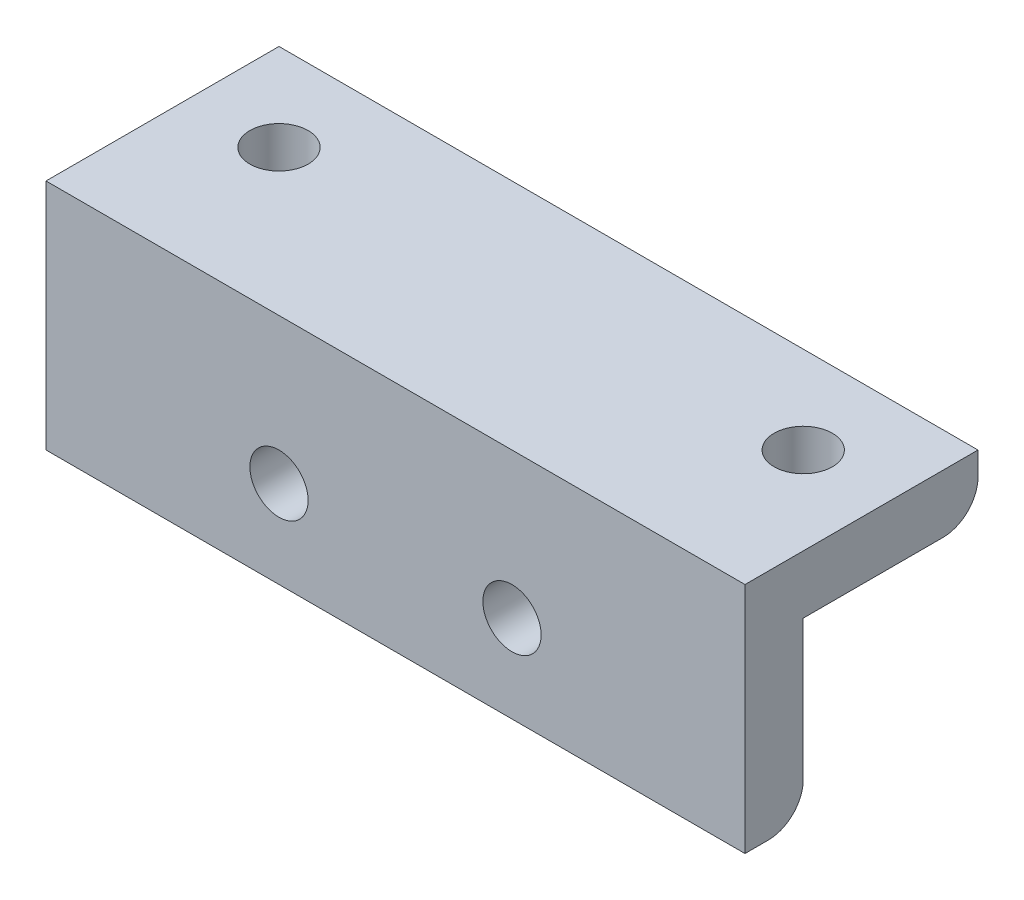
ISO-10303-21;
HEADER;
FILE_DESCRIPTION(('STEP AP214'),'2;1');
FILE_NAME('part.step','',(''),(''),'','','');
FILE_SCHEMA(('AUTOMOTIVE_DESIGN { 1 0 10303 214 1 1 1 1 }'));
ENDSEC;
DATA;
#1=APPLICATION_CONTEXT('core data for automotive mechanical design processes');
#2=APPLICATION_PROTOCOL_DEFINITION('international standard','automotive_design',2000,#1);
#3=PRODUCT_CONTEXT('',#1,'mechanical');
#4=PRODUCT('Part','Part','',(#3));
#5=PRODUCT_RELATED_PRODUCT_CATEGORY('part','',(#4));
#6=PRODUCT_DEFINITION_FORMATION('','',#4);
#7=PRODUCT_DEFINITION_CONTEXT('part definition',#1,'design');
#8=PRODUCT_DEFINITION('design','',#6,#7);
#9=PRODUCT_DEFINITION_SHAPE('','',#8);
#10=(LENGTH_UNIT() NAMED_UNIT(*) SI_UNIT(.MILLI.,.METRE.));
#11=(NAMED_UNIT(*) PLANE_ANGLE_UNIT() SI_UNIT($,.RADIAN.));
#12=(NAMED_UNIT(*) SI_UNIT($,.STERADIAN.) SOLID_ANGLE_UNIT());
#13=UNCERTAINTY_MEASURE_WITH_UNIT(LENGTH_MEASURE(1.E-05),#10,'distance_accuracy_value','');
#14=(GEOMETRIC_REPRESENTATION_CONTEXT(3) GLOBAL_UNCERTAINTY_ASSIGNED_CONTEXT((#13)) GLOBAL_UNIT_ASSIGNED_CONTEXT((#10,
#11,#12)) REPRESENTATION_CONTEXT('',''));
#15=CARTESIAN_POINT('',(0.,0.,0.));
#16=DIRECTION('',(0.,0.,1.));
#17=DIRECTION('',(1.,0.,0.));
#18=AXIS2_PLACEMENT_3D('',#15,#16,#17);
#19=CARTESIAN_POINT('',(76.2,23.2979648890606,25.3731034063662));
#20=DIRECTION('',(0.,0.,-1.));
#21=DIRECTION('',(0.,1.,0.));
#22=AXIS2_PLACEMENT_3D('',#19,#20,#21);
#23=PLANE('',#22);
#24=CARTESIAN_POINT('',(50.8,7.42296488906055,25.3731034063662));
#25=DIRECTION('',(0.,0.,1.));
#26=DIRECTION('',(1.,0.,0.));
#27=AXIS2_PLACEMENT_3D('',#24,#25,#26);
#28=CIRCLE('',#27,3.175);
#29=CARTESIAN_POINT('',(53.975,7.42296488906055,25.3731034063662));
#30=VERTEX_POINT('',#29);
#31=EDGE_CURVE('E158',#30,#30,#28,.T.);
#32=ORIENTED_EDGE('',*,*,#31,.F.);
#33=EDGE_LOOP('',(#32));
#34=FACE_BOUND('',#33,.T.);
#35=CARTESIAN_POINT('',(25.4,7.42296488906055,25.3731034063662));
#36=DIRECTION('',(0.,0.,1.));
#37=DIRECTION('',(1.,0.,0.));
#38=AXIS2_PLACEMENT_3D('',#35,#36,#37);
#39=CIRCLE('',#38,3.175);
#40=CARTESIAN_POINT('',(28.575,7.42296488906055,25.3731034063662));
#41=VERTEX_POINT('',#40);
#42=EDGE_CURVE('E147',#41,#41,#39,.T.);
#43=ORIENTED_EDGE('',*,*,#42,.F.);
#44=EDGE_LOOP('',(#43));
#45=FACE_BOUND('',#44,.T.);
#46=DIRECTION('',(0.,-1.,0.));
#47=VECTOR('',#46,1.);
#48=CARTESIAN_POINT('',(0.,23.2979648890606,25.3731034063662));
#49=LINE('',#48,#47);
#50=CARTESIAN_POINT('',(0.,23.2979648890606,25.3731034063662));
#51=VERTEX_POINT('',#50);
#52=CARTESIAN_POINT('',(0.,-2.10203511093945,25.3731034063662));
#53=VERTEX_POINT('',#52);
#54=EDGE_CURVE('E124',#51,#53,#49,.T.);
#55=ORIENTED_EDGE('',*,*,#54,.T.);
#56=DIRECTION('',(-1.,0.,0.));
#57=VECTOR('',#56,1.);
#58=CARTESIAN_POINT('',(76.2,-2.10203511093945,25.3731034063662));
#59=LINE('',#58,#57);
#60=CARTESIAN_POINT('',(76.2,-2.10203511093945,25.3731034063662));
#61=VERTEX_POINT('',#60);
#62=EDGE_CURVE('E106',#61,#53,#59,.T.);
#63=ORIENTED_EDGE('',*,*,#62,.F.);
#64=DIRECTION('',(0.,-1.,0.));
#65=VECTOR('',#64,1.);
#66=CARTESIAN_POINT('',(76.2,23.2979648890606,25.3731034063662));
#67=LINE('',#66,#65);
#68=CARTESIAN_POINT('',(76.2,23.2979648890606,25.3731034063662));
#69=VERTEX_POINT('',#68);
#70=EDGE_CURVE('E112',#69,#61,#67,.T.);
#71=ORIENTED_EDGE('',*,*,#70,.F.);
#72=DIRECTION('',(-1.,0.,0.));
#73=VECTOR('',#72,1.);
#74=CARTESIAN_POINT('',(76.2,23.2979648890606,25.3731034063662));
#75=LINE('',#74,#73);
#76=EDGE_CURVE('E175',#69,#51,#75,.T.);
#77=ORIENTED_EDGE('',*,*,#76,.T.);
#78=EDGE_LOOP('',(#55,#63,#71,#77));
#79=FACE_BOUND('',#78,.T.);
#80=ADVANCED_FACE('F34',(#34,#45,#79),#23,.F.);
#81=CARTESIAN_POINT('',(76.2,-2.10203511093945,19.0231034063662));
#82=DIRECTION('',(0.,1.,0.));
#83=DIRECTION('',(0.,0.,1.));
#84=AXIS2_PLACEMENT_3D('',#81,#82,#83);
#85=PLANE('',#84);
#86=DIRECTION('',(0.,0.,-1.));
#87=VECTOR('',#86,1.);
#88=CARTESIAN_POINT('',(0.,-2.10203511093945,19.0231034063662));
#89=LINE('',#88,#87);
#90=CARTESIAN_POINT('',(0.,-2.10203511093945,22.8331034063662));
#91=VERTEX_POINT('',#90);
#92=EDGE_CURVE('E177',#53,#91,#89,.T.);
#93=ORIENTED_EDGE('',*,*,#92,.T.);
#94=DIRECTION('',(-1.,0.,0.));
#95=VECTOR('',#94,1.);
#96=CARTESIAN_POINT('',(76.2,-2.10203511093945,22.8331034063662));
#97=LINE('',#96,#95);
#98=CARTESIAN_POINT('',(76.2,-2.10203511093945,22.8331034063662));
#99=VERTEX_POINT('',#98);
#100=EDGE_CURVE('E109',#91,#99,#97,.F.);
#101=ORIENTED_EDGE('',*,*,#100,.T.);
#102=DIRECTION('',(0.,0.,-1.));
#103=VECTOR('',#102,1.);
#104=CARTESIAN_POINT('',(76.2,-2.10203511093945,19.0231034063662));
#105=LINE('',#104,#103);
#106=EDGE_CURVE('E101',#61,#99,#105,.T.);
#107=ORIENTED_EDGE('',*,*,#106,.F.);
#108=ORIENTED_EDGE('',*,*,#62,.T.);
#109=EDGE_LOOP('',(#93,#101,#107,#108));
#110=FACE_BOUND('',#109,.T.);
#111=ADVANCED_FACE('F104',(#110),#85,.F.);
#112=CARTESIAN_POINT('',(76.2,16.9479648890606,19.0231034063662));
#113=DIRECTION('',(0.,0.,1.));
#114=DIRECTION('',(0.,-1.,0.));
#115=AXIS2_PLACEMENT_3D('',#112,#113,#114);
#116=PLANE('',#115);
#117=CARTESIAN_POINT('',(50.8,7.42296488906055,19.0231034063662));
#118=DIRECTION('',(0.,0.,1.));
#119=DIRECTION('',(0.,-1.,0.));
#120=AXIS2_PLACEMENT_3D('',#117,#118,#119);
#121=CIRCLE('',#120,3.175);
#122=CARTESIAN_POINT('',(53.975,7.42296488906055,19.0231034063662));
#123=VERTEX_POINT('',#122);
#124=EDGE_CURVE('E38',#123,#123,#121,.T.);
#125=ORIENTED_EDGE('',*,*,#124,.T.);
#126=EDGE_LOOP('',(#125));
#127=FACE_BOUND('',#126,.T.);
#128=CARTESIAN_POINT('',(25.4,7.42296488906055,19.0231034063662));
#129=DIRECTION('',(0.,0.,1.));
#130=DIRECTION('',(0.,-1.,0.));
#131=AXIS2_PLACEMENT_3D('',#128,#129,#130);
#132=CIRCLE('',#131,3.175);
#133=CARTESIAN_POINT('',(28.575,7.42296488906055,19.0231034063662));
#134=VERTEX_POINT('',#133);
#135=EDGE_CURVE('E144',#134,#134,#132,.T.);
#136=ORIENTED_EDGE('',*,*,#135,.T.);
#137=EDGE_LOOP('',(#136));
#138=FACE_BOUND('',#137,.T.);
#139=DIRECTION('',(0.,1.,0.));
#140=VECTOR('',#139,1.);
#141=CARTESIAN_POINT('',(76.2,16.9479648890606,19.0231034063662));
#142=LINE('',#141,#140);
#143=CARTESIAN_POINT('',(76.2,1.70796488906055,19.0231034063662));
#144=VERTEX_POINT('',#143);
#145=CARTESIAN_POINT('',(76.2,16.9479648890606,19.0231034063662));
#146=VERTEX_POINT('',#145);
#147=EDGE_CURVE('E111',#144,#146,#142,.T.);
#148=ORIENTED_EDGE('',*,*,#147,.F.);
#149=DIRECTION('',(-1.,0.,0.));
#150=VECTOR('',#149,1.);
#151=CARTESIAN_POINT('',(76.2,1.70796488906055,19.0231034063662));
#152=LINE('',#151,#150);
#153=CARTESIAN_POINT('',(0.,1.70796488906055,19.0231034063662));
#154=VERTEX_POINT('',#153);
#155=EDGE_CURVE('E125',#144,#154,#152,.T.);
#156=ORIENTED_EDGE('',*,*,#155,.T.);
#157=DIRECTION('',(0.,1.,0.));
#158=VECTOR('',#157,1.);
#159=CARTESIAN_POINT('',(0.,16.9479648890606,19.0231034063662));
#160=LINE('',#159,#158);
#161=CARTESIAN_POINT('',(0.,16.9479648890606,19.0231034063662));
#162=VERTEX_POINT('',#161);
#163=EDGE_CURVE('E179',#154,#162,#160,.T.);
#164=ORIENTED_EDGE('',*,*,#163,.T.);
#165=DIRECTION('',(-1.,0.,0.));
#166=VECTOR('',#165,1.);
#167=CARTESIAN_POINT('',(76.2,16.9479648890606,19.0231034063662));
#168=LINE('',#167,#166);
#169=EDGE_CURVE('E126',#146,#162,#168,.T.);
#170=ORIENTED_EDGE('',*,*,#169,.F.);
#171=EDGE_LOOP('',(#148,#156,#164,#170));
#172=FACE_BOUND('',#171,.T.);
#173=ADVANCED_FACE('F202',(#127,#138,#172),#116,.F.);
#174=CARTESIAN_POINT('',(76.2,16.9479648890606,19.0231034063662));
#175=DIRECTION('',(0.,1.,0.));
#176=DIRECTION('',(0.,0.,1.));
#177=AXIS2_PLACEMENT_3D('',#174,#175,#176);
#178=PLANE('',#177);
#179=CARTESIAN_POINT('',(66.675,16.9479648890606,9.49810340636623));
#180=DIRECTION('',(0.,1.,0.));
#181=DIRECTION('',(0.,0.,1.));
#182=AXIS2_PLACEMENT_3D('',#179,#180,#181);
#183=CIRCLE('',#182,3.175);
#184=CARTESIAN_POINT('',(66.675,16.9479648890606,12.6731034063662));
#185=VERTEX_POINT('',#184);
#186=EDGE_CURVE('E151',#185,#185,#183,.T.);
#187=ORIENTED_EDGE('',*,*,#186,.T.);
#188=EDGE_LOOP('',(#187));
#189=FACE_BOUND('',#188,.T.);
#190=CARTESIAN_POINT('',(9.525,16.9479648890606,9.49810340636623));
#191=DIRECTION('',(0.,1.,0.));
#192=DIRECTION('',(0.,0.,1.));
#193=AXIS2_PLACEMENT_3D('',#190,#191,#192);
#194=CIRCLE('',#193,3.175);
#195=CARTESIAN_POINT('',(9.525,16.9479648890606,12.6731034063662));
#196=VERTEX_POINT('',#195);
#197=EDGE_CURVE('E166',#196,#196,#194,.T.);
#198=ORIENTED_EDGE('',*,*,#197,.T.);
#199=EDGE_LOOP('',(#198));
#200=FACE_BOUND('',#199,.T.);
#201=DIRECTION('',(0.,0.,-1.));
#202=VECTOR('',#201,1.);
#203=CARTESIAN_POINT('',(0.,16.9479648890606,19.0231034063662));
#204=LINE('',#203,#202);
#205=CARTESIAN_POINT('',(0.,16.9479648890606,3.78310340636623));
#206=VERTEX_POINT('',#205);
#207=EDGE_CURVE('E181',#162,#206,#204,.T.);
#208=ORIENTED_EDGE('',*,*,#207,.T.);
#209=DIRECTION('',(-1.,0.,0.));
#210=VECTOR('',#209,1.);
#211=CARTESIAN_POINT('',(76.2,16.9479648890606,3.78310340636623));
#212=LINE('',#211,#210);
#213=CARTESIAN_POINT('',(76.2,16.9479648890606,3.78310340636623));
#214=VERTEX_POINT('',#213);
#215=EDGE_CURVE('E11',#206,#214,#212,.F.);
#216=ORIENTED_EDGE('',*,*,#215,.T.);
#217=DIRECTION('',(0.,0.,-1.));
#218=VECTOR('',#217,1.);
#219=CARTESIAN_POINT('',(76.2,16.9479648890606,19.0231034063662));
#220=LINE('',#219,#218);
#221=EDGE_CURVE('E170',#146,#214,#220,.T.);
#222=ORIENTED_EDGE('',*,*,#221,.F.);
#223=ORIENTED_EDGE('',*,*,#169,.T.);
#224=EDGE_LOOP('',(#208,#216,#222,#223));
#225=FACE_BOUND('',#224,.T.);
#226=ADVANCED_FACE('F204',(#189,#200,#225),#178,.F.);
#227=CARTESIAN_POINT('',(76.2,23.2979648890606,-0.0268965936337726));
#228=DIRECTION('',(0.,0.,1.));
#229=DIRECTION('',(0.,-1.,0.));
#230=AXIS2_PLACEMENT_3D('',#227,#228,#229);
#231=PLANE('',#230);
#232=DIRECTION('',(0.,1.,0.));
#233=VECTOR('',#232,1.);
#234=CARTESIAN_POINT('',(76.2,23.2979648890606,-0.0268965936337726));
#235=LINE('',#234,#233);
#236=CARTESIAN_POINT('',(76.2,20.7579648890606,-0.0268965936337729));
#237=VERTEX_POINT('',#236);
#238=CARTESIAN_POINT('',(76.2,23.2979648890606,-0.0268965936337726));
#239=VERTEX_POINT('',#238);
#240=EDGE_CURVE('E172',#237,#239,#235,.T.);
#241=ORIENTED_EDGE('',*,*,#240,.F.);
#242=DIRECTION('',(-1.,0.,0.));
#243=VECTOR('',#242,1.);
#244=CARTESIAN_POINT('',(76.2,20.7579648890606,-0.0268965936337729));
#245=LINE('',#244,#243);
#246=CARTESIAN_POINT('',(0.,20.7579648890606,-0.0268965936337729));
#247=VERTEX_POINT('',#246);
#248=EDGE_CURVE('E43',#237,#247,#245,.T.);
#249=ORIENTED_EDGE('',*,*,#248,.T.);
#250=DIRECTION('',(0.,1.,0.));
#251=VECTOR('',#250,1.);
#252=CARTESIAN_POINT('',(0.,23.2979648890606,-0.0268965936337726));
#253=LINE('',#252,#251);
#254=CARTESIAN_POINT('',(0.,23.2979648890606,-0.0268965936337726));
#255=VERTEX_POINT('',#254);
#256=EDGE_CURVE('E183',#247,#255,#253,.T.);
#257=ORIENTED_EDGE('',*,*,#256,.T.);
#258=DIRECTION('',(-1.,0.,0.));
#259=VECTOR('',#258,1.);
#260=CARTESIAN_POINT('',(76.2,23.2979648890606,-0.0268965936337726));
#261=LINE('',#260,#259);
#262=EDGE_CURVE('E132',#239,#255,#261,.T.);
#263=ORIENTED_EDGE('',*,*,#262,.F.);
#264=EDGE_LOOP('',(#241,#249,#257,#263));
#265=FACE_BOUND('',#264,.T.);
#266=ADVANCED_FACE('F207',(#265),#231,.F.);
#267=CARTESIAN_POINT('',(76.2,23.2979648890606,-0.0268965936337726));
#268=DIRECTION('',(0.,-1.,0.));
#269=DIRECTION('',(0.,0.,-1.));
#270=AXIS2_PLACEMENT_3D('',#267,#268,#269);
#271=PLANE('',#270);
#272=CARTESIAN_POINT('',(66.675,23.2979648890606,9.49810340636623));
#273=DIRECTION('',(0.,1.,0.));
#274=DIRECTION('',(0.,0.,1.));
#275=AXIS2_PLACEMENT_3D('',#272,#273,#274);
#276=CIRCLE('',#275,3.175);
#277=CARTESIAN_POINT('',(66.675,23.2979648890606,12.6731034063662));
#278=VERTEX_POINT('',#277);
#279=EDGE_CURVE('E146',#278,#278,#276,.T.);
#280=ORIENTED_EDGE('',*,*,#279,.F.);
#281=EDGE_LOOP('',(#280));
#282=FACE_BOUND('',#281,.T.);
#283=CARTESIAN_POINT('',(9.525,23.2979648890606,9.49810340636623));
#284=DIRECTION('',(0.,1.,0.));
#285=DIRECTION('',(0.,0.,1.));
#286=AXIS2_PLACEMENT_3D('',#283,#284,#285);
#287=CIRCLE('',#286,3.175);
#288=CARTESIAN_POINT('',(9.525,23.2979648890606,12.6731034063662));
#289=VERTEX_POINT('',#288);
#290=EDGE_CURVE('E163',#289,#289,#287,.T.);
#291=ORIENTED_EDGE('',*,*,#290,.F.);
#292=EDGE_LOOP('',(#291));
#293=FACE_BOUND('',#292,.T.);
#294=DIRECTION('',(0.,0.,1.));
#295=VECTOR('',#294,1.);
#296=CARTESIAN_POINT('',(0.,23.2979648890606,-0.0268965936337726));
#297=LINE('',#296,#295);
#298=EDGE_CURVE('E121',#255,#51,#297,.T.);
#299=ORIENTED_EDGE('',*,*,#298,.T.);
#300=ORIENTED_EDGE('',*,*,#76,.F.);
#301=DIRECTION('',(0.,0.,1.));
#302=VECTOR('',#301,1.);
#303=CARTESIAN_POINT('',(76.2,23.2979648890606,-0.0268965936337726));
#304=LINE('',#303,#302);
#305=EDGE_CURVE('E117',#239,#69,#304,.T.);
#306=ORIENTED_EDGE('',*,*,#305,.F.);
#307=ORIENTED_EDGE('',*,*,#262,.T.);
#308=EDGE_LOOP('',(#299,#300,#306,#307));
#309=FACE_BOUND('',#308,.T.);
#310=ADVANCED_FACE('F190',(#282,#293,#309),#271,.F.);
#311=CARTESIAN_POINT('',(76.2,0.,0.));
#312=DIRECTION('',(-1.,0.,0.));
#313=DIRECTION('',(0.,0.,1.));
#314=AXIS2_PLACEMENT_3D('',#311,#312,#313);
#315=PLANE('',#314);
#316=ORIENTED_EDGE('',*,*,#106,.T.);
#317=CARTESIAN_POINT('',(76.2,1.70796488906055,22.8331034063662));
#318=DIRECTION('',(-1.,0.,0.));
#319=DIRECTION('',(0.,0.,1.));
#320=AXIS2_PLACEMENT_3D('',#317,#318,#319);
#321=CIRCLE('',#320,3.81);
#322=EDGE_CURVE('E141',#99,#144,#321,.F.);
#323=ORIENTED_EDGE('',*,*,#322,.T.);
#324=ORIENTED_EDGE('',*,*,#147,.T.);
#325=ORIENTED_EDGE('',*,*,#221,.T.);
#326=CARTESIAN_POINT('',(76.2,20.7579648890606,3.78310340636623));
#327=DIRECTION('',(-1.,0.,0.));
#328=DIRECTION('',(0.,0.,1.));
#329=AXIS2_PLACEMENT_3D('',#326,#327,#328);
#330=CIRCLE('',#329,3.81);
#331=EDGE_CURVE('E51',#214,#237,#330,.F.);
#332=ORIENTED_EDGE('',*,*,#331,.T.);
#333=ORIENTED_EDGE('',*,*,#240,.T.);
#334=ORIENTED_EDGE('',*,*,#305,.T.);
#335=ORIENTED_EDGE('',*,*,#70,.T.);
#336=EDGE_LOOP('',(#316,#323,#324,#325,#332,#333,#334,#335));
#337=FACE_BOUND('',#336,.T.);
#338=ADVANCED_FACE('F115',(#337),#315,.F.);
#339=CARTESIAN_POINT('',(0.,0.,0.));
#340=DIRECTION('',(-1.,0.,0.));
#341=DIRECTION('',(0.,0.,1.));
#342=AXIS2_PLACEMENT_3D('',#339,#340,#341);
#343=PLANE('',#342);
#344=ORIENTED_EDGE('',*,*,#163,.F.);
#345=CARTESIAN_POINT('',(0.,1.70796488906055,22.8331034063662));
#346=DIRECTION('',(-1.,0.,0.));
#347=DIRECTION('',(0.,0.,1.));
#348=AXIS2_PLACEMENT_3D('',#345,#346,#347);
#349=CIRCLE('',#348,3.81);
#350=EDGE_CURVE('E137',#154,#91,#349,.T.);
#351=ORIENTED_EDGE('',*,*,#350,.T.);
#352=ORIENTED_EDGE('',*,*,#92,.F.);
#353=ORIENTED_EDGE('',*,*,#54,.F.);
#354=ORIENTED_EDGE('',*,*,#298,.F.);
#355=ORIENTED_EDGE('',*,*,#256,.F.);
#356=CARTESIAN_POINT('',(0.,20.7579648890606,3.78310340636623));
#357=DIRECTION('',(-1.,0.,0.));
#358=DIRECTION('',(0.,0.,1.));
#359=AXIS2_PLACEMENT_3D('',#356,#357,#358);
#360=CIRCLE('',#359,3.81);
#361=EDGE_CURVE('E129',#247,#206,#360,.T.);
#362=ORIENTED_EDGE('',*,*,#361,.T.);
#363=ORIENTED_EDGE('',*,*,#207,.F.);
#364=EDGE_LOOP('',(#344,#351,#352,#353,#354,#355,#362,#363));
#365=FACE_BOUND('',#364,.T.);
#366=ADVANCED_FACE('F195',(#365),#343,.T.);
#367=CARTESIAN_POINT('',(76.2,1.70796488906055,22.8331034063662));
#368=DIRECTION('',(-1.,0.,0.));
#369=DIRECTION('',(0.,0.,1.));
#370=AXIS2_PLACEMENT_3D('',#367,#368,#369);
#371=CYLINDRICAL_SURFACE('',#370,3.81);
#372=ORIENTED_EDGE('',*,*,#322,.F.);
#373=ORIENTED_EDGE('',*,*,#100,.F.);
#374=ORIENTED_EDGE('',*,*,#350,.F.);
#375=ORIENTED_EDGE('',*,*,#155,.F.);
#376=EDGE_LOOP('',(#372,#373,#374,#375));
#377=FACE_BOUND('',#376,.T.);
#378=ADVANCED_FACE('F197',(#377),#371,.T.);
#379=CARTESIAN_POINT('',(76.2,20.7579648890606,3.78310340636623));
#380=DIRECTION('',(-1.,0.,0.));
#381=DIRECTION('',(0.,0.,1.));
#382=AXIS2_PLACEMENT_3D('',#379,#380,#381);
#383=CYLINDRICAL_SURFACE('',#382,3.81);
#384=ORIENTED_EDGE('',*,*,#331,.F.);
#385=ORIENTED_EDGE('',*,*,#215,.F.);
#386=ORIENTED_EDGE('',*,*,#361,.F.);
#387=ORIENTED_EDGE('',*,*,#248,.F.);
#388=EDGE_LOOP('',(#384,#385,#386,#387));
#389=FACE_BOUND('',#388,.T.);
#390=ADVANCED_FACE('F36',(#389),#383,.T.);
#391=CARTESIAN_POINT('',(9.525,-52.9020351109395,9.49810340636622));
#392=DIRECTION('',(0.,1.,0.));
#393=DIRECTION('',(0.,0.,1.));
#394=AXIS2_PLACEMENT_3D('',#391,#392,#393);
#395=CYLINDRICAL_SURFACE('',#394,3.175);
#396=CARTESIAN_POINT('',(9.525,23.2979648890606,12.6731034063662));
#397=CARTESIAN_POINT('',(9.525,23.2318190557272,12.6731034063662));
#398=CARTESIAN_POINT('',(9.525,23.1656732223939,12.6731034063662));
#399=CARTESIAN_POINT('',(9.525,23.0333815557272,12.6731034063662));
#400=CARTESIAN_POINT('',(9.525,22.9672357223939,12.6731034063662));
#401=CARTESIAN_POINT('',(9.525,22.8349440557272,12.6731034063662));
#402=CARTESIAN_POINT('',(9.525,22.7687982223939,12.6731034063662));
#403=CARTESIAN_POINT('',(9.525,22.6365065557272,12.6731034063662));
#404=CARTESIAN_POINT('',(9.525,22.5703607223939,12.6731034063662));
#405=CARTESIAN_POINT('',(9.525,22.4380690557272,12.6731034063662));
#406=CARTESIAN_POINT('',(9.525,22.3719232223939,12.6731034063662));
#407=CARTESIAN_POINT('',(9.525,22.2396315557272,12.6731034063662));
#408=CARTESIAN_POINT('',(9.525,22.1734857223939,12.6731034063662));
#409=CARTESIAN_POINT('',(9.525,22.0411940557272,12.6731034063662));
#410=CARTESIAN_POINT('',(9.525,21.9750482223939,12.6731034063662));
#411=CARTESIAN_POINT('',(9.525,21.8427565557272,12.6731034063662));
#412=CARTESIAN_POINT('',(9.525,21.7766107223939,12.6731034063662));
#413=CARTESIAN_POINT('',(9.525,21.6443190557272,12.6731034063662));
#414=CARTESIAN_POINT('',(9.525,21.5781732223939,12.6731034063662));
#415=CARTESIAN_POINT('',(9.525,21.4458815557272,12.6731034063662));
#416=CARTESIAN_POINT('',(9.525,21.3797357223939,12.6731034063662));
#417=CARTESIAN_POINT('',(9.525,21.2474440557272,12.6731034063662));
#418=CARTESIAN_POINT('',(9.525,21.1812982223939,12.6731034063662));
#419=CARTESIAN_POINT('',(9.525,21.0490065557272,12.6731034063662));
#420=CARTESIAN_POINT('',(9.525,20.9828607223939,12.6731034063662));
#421=CARTESIAN_POINT('',(9.525,20.8505690557272,12.6731034063662));
#422=CARTESIAN_POINT('',(9.525,20.7844232223939,12.6731034063662));
#423=CARTESIAN_POINT('',(9.525,20.6521315557272,12.6731034063662));
#424=CARTESIAN_POINT('',(9.525,20.5859857223939,12.6731034063662));
#425=CARTESIAN_POINT('',(9.525,20.4536940557272,12.6731034063662));
#426=CARTESIAN_POINT('',(9.525,20.3875482223939,12.6731034063662));
#427=CARTESIAN_POINT('',(9.525,20.2552565557272,12.6731034063662));
#428=CARTESIAN_POINT('',(9.525,20.1891107223939,12.6731034063662));
#429=CARTESIAN_POINT('',(9.525,20.0568190557272,12.6731034063662));
#430=CARTESIAN_POINT('',(9.525,19.9906732223939,12.6731034063662));
#431=CARTESIAN_POINT('',(9.525,19.8583815557272,12.6731034063662));
#432=CARTESIAN_POINT('',(9.525,19.7922357223939,12.6731034063662));
#433=CARTESIAN_POINT('',(9.525,19.6599440557272,12.6731034063662));
#434=CARTESIAN_POINT('',(9.525,19.5937982223939,12.6731034063662));
#435=CARTESIAN_POINT('',(9.525,19.4615065557272,12.6731034063662));
#436=CARTESIAN_POINT('',(9.525,19.3953607223939,12.6731034063662));
#437=CARTESIAN_POINT('',(9.525,19.2630690557272,12.6731034063662));
#438=CARTESIAN_POINT('',(9.525,19.1969232223939,12.6731034063662));
#439=CARTESIAN_POINT('',(9.525,19.0646315557272,12.6731034063662));
#440=CARTESIAN_POINT('',(9.525,18.9984857223939,12.6731034063662));
#441=CARTESIAN_POINT('',(9.525,18.8661940557272,12.6731034063662));
#442=CARTESIAN_POINT('',(9.525,18.8000482223939,12.6731034063662));
#443=CARTESIAN_POINT('',(9.525,18.6677565557272,12.6731034063662));
#444=CARTESIAN_POINT('',(9.525,18.6016107223939,12.6731034063662));
#445=CARTESIAN_POINT('',(9.525,18.4693190557272,12.6731034063662));
#446=CARTESIAN_POINT('',(9.525,18.4031732223939,12.6731034063662));
#447=CARTESIAN_POINT('',(9.525,18.2708815557272,12.6731034063662));
#448=CARTESIAN_POINT('',(9.525,18.2047357223939,12.6731034063662));
#449=CARTESIAN_POINT('',(9.525,18.0724440557272,12.6731034063662));
#450=CARTESIAN_POINT('',(9.525,18.0062982223939,12.6731034063662));
#451=CARTESIAN_POINT('',(9.525,17.8740065557272,12.6731034063662));
#452=CARTESIAN_POINT('',(9.525,17.8078607223939,12.6731034063662));
#453=CARTESIAN_POINT('',(9.525,17.6755690557272,12.6731034063662));
#454=CARTESIAN_POINT('',(9.525,17.6094232223939,12.6731034063662));
#455=CARTESIAN_POINT('',(9.525,17.4771315557272,12.6731034063662));
#456=CARTESIAN_POINT('',(9.525,17.4109857223939,12.6731034063662));
#457=CARTESIAN_POINT('',(9.525,17.2786940557272,12.6731034063662));
#458=CARTESIAN_POINT('',(9.525,17.2125482223939,12.6731034063662));
#459=CARTESIAN_POINT('',(9.525,17.0802565557272,12.6731034063662));
#460=CARTESIAN_POINT('',(9.525,17.0141107223939,12.6731034063662));
#461=CARTESIAN_POINT('',(9.525,16.9479648890606,12.6731034063662));
#462=B_SPLINE_CURVE_WITH_KNOTS('',3,(#396,#397,#398,#399,#400,#401,#402,#403,#404,#405,#406,
#407,#408,#409,#410,#411,#412,#413,#414,#415,#416,#417,#418,#419,#420,#421,#422,#423,#424,#425,
#426,#427,#428,#429,#430,#431,#432,#433,#434,#435,#436,#437,#438,#439,#440,#441,#442,#443,#444,
#445,#446,#447,#448,#449,#450,#451,#452,#453,#454,#455,#456,#457,#458,#459,#460,#461),
.UNSPECIFIED.,.F.,.F.,(4,2,2,2,2,2,2,2,2,2,2,2,2,2,2,2,2,2,2,2,2,2,2,2,2,2,2,2,2,2,2,2,4),(0.,
0.198437499999995,0.396875000000005,0.5953125,0.793749999999996,0.992187500000005,1.190625,
1.3890625,1.58749999999999,1.7859375,1.984375,2.18281249999999,2.38125,2.5796875,
2.77812499999999,2.9765625,3.175,3.37343749999999,3.571875,3.7703125,3.96874999999999,4.1671875,
4.365625,4.56406249999999,4.7625,4.9609375,5.15937499999999,5.35781249999999,5.55625,
5.75468749999999,5.95312499999999,6.1515625,6.34999999999999),.UNSPECIFIED.);
#463=EDGE_CURVE('BSEAM233',#289,#196,#462,.T.);
#464=ORIENTED_EDGE('',*,*,#290,.T.);
#465=ORIENTED_EDGE('',*,*,#197,.F.);
#466=ORIENTED_EDGE('',*,*,#463,.T.);
#467=ORIENTED_EDGE('',*,*,#463,.F.);
#468=EDGE_LOOP('',(#464,#466,#465,#467));
#469=FACE_BOUND('',#468,.T.);
#470=ADVANCED_FACE('F233',(#469),#395,.F.);
#471=CARTESIAN_POINT('',(66.675,-52.9020351109395,9.49810340636622));
#472=DIRECTION('',(0.,1.,0.));
#473=DIRECTION('',(0.,0.,1.));
#474=AXIS2_PLACEMENT_3D('',#471,#472,#473);
#475=CYLINDRICAL_SURFACE('',#474,3.175);
#476=CARTESIAN_POINT('',(66.675,23.2979648890606,12.6731034063662));
#477=CARTESIAN_POINT('',(66.675,23.2318190557272,12.6731034063662));
#478=CARTESIAN_POINT('',(66.675,23.1656732223939,12.6731034063662));
#479=CARTESIAN_POINT('',(66.675,23.0333815557272,12.6731034063662));
#480=CARTESIAN_POINT('',(66.675,22.9672357223939,12.6731034063662));
#481=CARTESIAN_POINT('',(66.675,22.8349440557272,12.6731034063662));
#482=CARTESIAN_POINT('',(66.675,22.7687982223939,12.6731034063662));
#483=CARTESIAN_POINT('',(66.675,22.6365065557272,12.6731034063662));
#484=CARTESIAN_POINT('',(66.675,22.5703607223939,12.6731034063662));
#485=CARTESIAN_POINT('',(66.675,22.4380690557272,12.6731034063662));
#486=CARTESIAN_POINT('',(66.675,22.3719232223939,12.6731034063662));
#487=CARTESIAN_POINT('',(66.675,22.2396315557272,12.6731034063662));
#488=CARTESIAN_POINT('',(66.675,22.1734857223939,12.6731034063662));
#489=CARTESIAN_POINT('',(66.675,22.0411940557272,12.6731034063662));
#490=CARTESIAN_POINT('',(66.675,21.9750482223939,12.6731034063662));
#491=CARTESIAN_POINT('',(66.675,21.8427565557272,12.6731034063662));
#492=CARTESIAN_POINT('',(66.675,21.7766107223939,12.6731034063662));
#493=CARTESIAN_POINT('',(66.675,21.6443190557272,12.6731034063662));
#494=CARTESIAN_POINT('',(66.675,21.5781732223939,12.6731034063662));
#495=CARTESIAN_POINT('',(66.675,21.4458815557272,12.6731034063662));
#496=CARTESIAN_POINT('',(66.675,21.3797357223939,12.6731034063662));
#497=CARTESIAN_POINT('',(66.675,21.2474440557272,12.6731034063662));
#498=CARTESIAN_POINT('',(66.675,21.1812982223939,12.6731034063662));
#499=CARTESIAN_POINT('',(66.675,21.0490065557272,12.6731034063662));
#500=CARTESIAN_POINT('',(66.675,20.9828607223939,12.6731034063662));
#501=CARTESIAN_POINT('',(66.675,20.8505690557272,12.6731034063662));
#502=CARTESIAN_POINT('',(66.675,20.7844232223939,12.6731034063662));
#503=CARTESIAN_POINT('',(66.675,20.6521315557272,12.6731034063662));
#504=CARTESIAN_POINT('',(66.675,20.5859857223939,12.6731034063662));
#505=CARTESIAN_POINT('',(66.675,20.4536940557272,12.6731034063662));
#506=CARTESIAN_POINT('',(66.675,20.3875482223939,12.6731034063662));
#507=CARTESIAN_POINT('',(66.675,20.2552565557272,12.6731034063662));
#508=CARTESIAN_POINT('',(66.675,20.1891107223939,12.6731034063662));
#509=CARTESIAN_POINT('',(66.675,20.0568190557272,12.6731034063662));
#510=CARTESIAN_POINT('',(66.675,19.9906732223939,12.6731034063662));
#511=CARTESIAN_POINT('',(66.675,19.8583815557272,12.6731034063662));
#512=CARTESIAN_POINT('',(66.675,19.7922357223939,12.6731034063662));
#513=CARTESIAN_POINT('',(66.675,19.6599440557272,12.6731034063662));
#514=CARTESIAN_POINT('',(66.675,19.5937982223939,12.6731034063662));
#515=CARTESIAN_POINT('',(66.675,19.4615065557272,12.6731034063662));
#516=CARTESIAN_POINT('',(66.675,19.3953607223939,12.6731034063662));
#517=CARTESIAN_POINT('',(66.675,19.2630690557272,12.6731034063662));
#518=CARTESIAN_POINT('',(66.675,19.1969232223939,12.6731034063662));
#519=CARTESIAN_POINT('',(66.675,19.0646315557272,12.6731034063662));
#520=CARTESIAN_POINT('',(66.675,18.9984857223939,12.6731034063662));
#521=CARTESIAN_POINT('',(66.675,18.8661940557272,12.6731034063662));
#522=CARTESIAN_POINT('',(66.675,18.8000482223939,12.6731034063662));
#523=CARTESIAN_POINT('',(66.675,18.6677565557272,12.6731034063662));
#524=CARTESIAN_POINT('',(66.675,18.6016107223939,12.6731034063662));
#525=CARTESIAN_POINT('',(66.675,18.4693190557272,12.6731034063662));
#526=CARTESIAN_POINT('',(66.675,18.4031732223939,12.6731034063662));
#527=CARTESIAN_POINT('',(66.675,18.2708815557272,12.6731034063662));
#528=CARTESIAN_POINT('',(66.675,18.2047357223939,12.6731034063662));
#529=CARTESIAN_POINT('',(66.675,18.0724440557272,12.6731034063662));
#530=CARTESIAN_POINT('',(66.675,18.0062982223939,12.6731034063662));
#531=CARTESIAN_POINT('',(66.675,17.8740065557272,12.6731034063662));
#532=CARTESIAN_POINT('',(66.675,17.8078607223939,12.6731034063662));
#533=CARTESIAN_POINT('',(66.675,17.6755690557272,12.6731034063662));
#534=CARTESIAN_POINT('',(66.675,17.6094232223939,12.6731034063662));
#535=CARTESIAN_POINT('',(66.675,17.4771315557272,12.6731034063662));
#536=CARTESIAN_POINT('',(66.675,17.4109857223939,12.6731034063662));
#537=CARTESIAN_POINT('',(66.675,17.2786940557272,12.6731034063662));
#538=CARTESIAN_POINT('',(66.675,17.2125482223939,12.6731034063662));
#539=CARTESIAN_POINT('',(66.675,17.0802565557272,12.6731034063662));
#540=CARTESIAN_POINT('',(66.675,17.0141107223939,12.6731034063662));
#541=CARTESIAN_POINT('',(66.675,16.9479648890606,12.6731034063662));
#542=B_SPLINE_CURVE_WITH_KNOTS('',3,(#476,#477,#478,#479,#480,#481,#482,#483,#484,#485,#486,
#487,#488,#489,#490,#491,#492,#493,#494,#495,#496,#497,#498,#499,#500,#501,#502,#503,#504,#505,
#506,#507,#508,#509,#510,#511,#512,#513,#514,#515,#516,#517,#518,#519,#520,#521,#522,#523,#524,
#525,#526,#527,#528,#529,#530,#531,#532,#533,#534,#535,#536,#537,#538,#539,#540,#541),
.UNSPECIFIED.,.F.,.F.,(4,2,2,2,2,2,2,2,2,2,2,2,2,2,2,2,2,2,2,2,2,2,2,2,2,2,2,2,2,2,2,2,4),(0.,
0.198437499999995,0.396875000000005,0.5953125,0.793749999999996,0.992187500000005,1.190625,
1.3890625,1.58749999999999,1.7859375,1.984375,2.18281249999999,2.38125,2.5796875,
2.77812499999999,2.9765625,3.175,3.37343749999999,3.571875,3.7703125,3.96874999999999,4.1671875,
4.365625,4.56406249999999,4.7625,4.9609375,5.15937499999999,5.35781249999999,5.55625,
5.75468749999999,5.95312499999999,6.1515625,6.34999999999999),.UNSPECIFIED.);
#543=EDGE_CURVE('BSEAM242',#278,#185,#542,.T.);
#544=ORIENTED_EDGE('',*,*,#279,.T.);
#545=ORIENTED_EDGE('',*,*,#186,.F.);
#546=ORIENTED_EDGE('',*,*,#543,.T.);
#547=ORIENTED_EDGE('',*,*,#543,.F.);
#548=EDGE_LOOP('',(#544,#546,#545,#547));
#549=FACE_BOUND('',#548,.T.);
#550=ADVANCED_FACE('F242',(#549),#475,.F.);
#551=CARTESIAN_POINT('',(25.4,7.42296488906055,-50.8268965936338));
#552=DIRECTION('',(0.,0.,1.));
#553=DIRECTION('',(1.,0.,0.));
#554=AXIS2_PLACEMENT_3D('',#551,#552,#553);
#555=CYLINDRICAL_SURFACE('',#554,3.175);
#556=CARTESIAN_POINT('',(28.575,7.42296488906055,25.3731034063662));
#557=CARTESIAN_POINT('',(28.575,7.42296488906055,25.3069575730329));
#558=CARTESIAN_POINT('',(28.575,7.42296488906055,25.2408117396996));
#559=CARTESIAN_POINT('',(28.575,7.42296488906055,25.1085200730329));
#560=CARTESIAN_POINT('',(28.575,7.42296488906055,25.0423742396996));
#561=CARTESIAN_POINT('',(28.575,7.42296488906055,24.9100825730329));
#562=CARTESIAN_POINT('',(28.575,7.42296488906055,24.8439367396996));
#563=CARTESIAN_POINT('',(28.575,7.42296488906055,24.7116450730329));
#564=CARTESIAN_POINT('',(28.575,7.42296488906055,24.6454992396996));
#565=CARTESIAN_POINT('',(28.575,7.42296488906055,24.5132075730329));
#566=CARTESIAN_POINT('',(28.575,7.42296488906055,24.4470617396996));
#567=CARTESIAN_POINT('',(28.575,7.42296488906055,24.3147700730329));
#568=CARTESIAN_POINT('',(28.575,7.42296488906055,24.2486242396996));
#569=CARTESIAN_POINT('',(28.575,7.42296488906055,24.1163325730329));
#570=CARTESIAN_POINT('',(28.575,7.42296488906055,24.0501867396996));
#571=CARTESIAN_POINT('',(28.575,7.42296488906055,23.9178950730329));
#572=CARTESIAN_POINT('',(28.575,7.42296488906055,23.8517492396996));
#573=CARTESIAN_POINT('',(28.575,7.42296488906055,23.7194575730329));
#574=CARTESIAN_POINT('',(28.575,7.42296488906055,23.6533117396996));
#575=CARTESIAN_POINT('',(28.575,7.42296488906055,23.5210200730329));
#576=CARTESIAN_POINT('',(28.575,7.42296488906055,23.4548742396996));
#577=CARTESIAN_POINT('',(28.575,7.42296488906055,23.3225825730329));
#578=CARTESIAN_POINT('',(28.575,7.42296488906055,23.2564367396996));
#579=CARTESIAN_POINT('',(28.575,7.42296488906055,23.1241450730329));
#580=CARTESIAN_POINT('',(28.575,7.42296488906055,23.0579992396996));
#581=CARTESIAN_POINT('',(28.575,7.42296488906055,22.9257075730329));
#582=CARTESIAN_POINT('',(28.575,7.42296488906055,22.8595617396996));
#583=CARTESIAN_POINT('',(28.575,7.42296488906055,22.7272700730329));
#584=CARTESIAN_POINT('',(28.575,7.42296488906055,22.6611242396996));
#585=CARTESIAN_POINT('',(28.575,7.42296488906055,22.5288325730329));
#586=CARTESIAN_POINT('',(28.575,7.42296488906055,22.4626867396995));
#587=CARTESIAN_POINT('',(28.575,7.42296488906055,22.3303950730329));
#588=CARTESIAN_POINT('',(28.575,7.42296488906055,22.2642492396995));
#589=CARTESIAN_POINT('',(28.575,7.42296488906055,22.1319575730329));
#590=CARTESIAN_POINT('',(28.575,7.42296488906055,22.0658117396996));
#591=CARTESIAN_POINT('',(28.575,7.42296488906055,21.9335200730329));
#592=CARTESIAN_POINT('',(28.575,7.42296488906055,21.8673742396995));
#593=CARTESIAN_POINT('',(28.575,7.42296488906055,21.7350825730329));
#594=CARTESIAN_POINT('',(28.575,7.42296488906055,21.6689367396995));
#595=CARTESIAN_POINT('',(28.575,7.42296488906055,21.5366450730329));
#596=CARTESIAN_POINT('',(28.575,7.42296488906055,21.4704992396995));
#597=CARTESIAN_POINT('',(28.575,7.42296488906055,21.3382075730329));
#598=CARTESIAN_POINT('',(28.575,7.42296488906055,21.2720617396995));
#599=CARTESIAN_POINT('',(28.575,7.42296488906055,21.1397700730329));
#600=CARTESIAN_POINT('',(28.575,7.42296488906055,21.0736242396995));
#601=CARTESIAN_POINT('',(28.575,7.42296488906055,20.9413325730329));
#602=CARTESIAN_POINT('',(28.575,7.42296488906055,20.8751867396995));
#603=CARTESIAN_POINT('',(28.575,7.42296488906055,20.7428950730329));
#604=CARTESIAN_POINT('',(28.575,7.42296488906055,20.6767492396995));
#605=CARTESIAN_POINT('',(28.575,7.42296488906055,20.5444575730329));
#606=CARTESIAN_POINT('',(28.575,7.42296488906055,20.4783117396995));
#607=CARTESIAN_POINT('',(28.575,7.42296488906055,20.3460200730329));
#608=CARTESIAN_POINT('',(28.575,7.42296488906055,20.2798742396995));
#609=CARTESIAN_POINT('',(28.575,7.42296488906055,20.1475825730329));
#610=CARTESIAN_POINT('',(28.575,7.42296488906055,20.0814367396995));
#611=CARTESIAN_POINT('',(28.575,7.42296488906055,19.9491450730329));
#612=CARTESIAN_POINT('',(28.575,7.42296488906055,19.8829992396995));
#613=CARTESIAN_POINT('',(28.575,7.42296488906055,19.7507075730329));
#614=CARTESIAN_POINT('',(28.575,7.42296488906055,19.6845617396995));
#615=CARTESIAN_POINT('',(28.575,7.42296488906055,19.5522700730329));
#616=CARTESIAN_POINT('',(28.575,7.42296488906055,19.4861242396995));
#617=CARTESIAN_POINT('',(28.575,7.42296488906055,19.3538325730329));
#618=CARTESIAN_POINT('',(28.575,7.42296488906055,19.2876867396995));
#619=CARTESIAN_POINT('',(28.575,7.42296488906055,19.1553950730329));
#620=CARTESIAN_POINT('',(28.575,7.42296488906055,19.0892492396995));
#621=CARTESIAN_POINT('',(28.575,7.42296488906055,19.0231034063662));
#622=B_SPLINE_CURVE_WITH_KNOTS('',3,(#556,#557,#558,#559,#560,#561,#562,#563,#564,#565,#566,
#567,#568,#569,#570,#571,#572,#573,#574,#575,#576,#577,#578,#579,#580,#581,#582,#583,#584,#585,
#586,#587,#588,#589,#590,#591,#592,#593,#594,#595,#596,#597,#598,#599,#600,#601,#602,#603,#604,
#605,#606,#607,#608,#609,#610,#611,#612,#613,#614,#615,#616,#617,#618,#619,#620,#621),
.UNSPECIFIED.,.F.,.F.,(4,2,2,2,2,2,2,2,2,2,2,2,2,2,2,2,2,2,2,2,2,2,2,2,2,2,2,2,2,2,2,2,4),(0.,
0.198437499999995,0.396875000000005,0.5953125,0.79375000000001,0.992187500000005,1.190625,
1.38906250000001,1.58750000000001,1.7859375,1.98437500000001,2.18281250000001,2.38125,
2.57968750000001,2.77812500000001,2.97656250000002,3.17500000000001,3.37343750000001,
3.57187500000002,3.77031250000001,3.96875000000002,4.16718750000002,4.36562500000001,
4.56406250000002,4.76250000000002,4.96093750000001,5.15937500000002,5.35781250000002,
5.55625000000001,5.75468750000002,5.95312500000002,6.15156250000003,6.35000000000002),.UNSPECIFIED.);
#623=EDGE_CURVE('BSEAM246',#41,#134,#622,.T.);
#624=ORIENTED_EDGE('',*,*,#42,.T.);
#625=ORIENTED_EDGE('',*,*,#135,.F.);
#626=ORIENTED_EDGE('',*,*,#623,.T.);
#627=ORIENTED_EDGE('',*,*,#623,.F.);
#628=EDGE_LOOP('',(#624,#626,#625,#627));
#629=FACE_BOUND('',#628,.T.);
#630=ADVANCED_FACE('F246',(#629),#555,.F.);
#631=CARTESIAN_POINT('',(50.8,7.42296488906055,-50.8268965936338));
#632=DIRECTION('',(0.,0.,1.));
#633=DIRECTION('',(1.,0.,0.));
#634=AXIS2_PLACEMENT_3D('',#631,#632,#633);
#635=CYLINDRICAL_SURFACE('',#634,3.175);
#636=CARTESIAN_POINT('',(53.975,7.42296488906055,25.3731034063662));
#637=CARTESIAN_POINT('',(53.975,7.42296488906055,25.3069575730329));
#638=CARTESIAN_POINT('',(53.975,7.42296488906055,25.2408117396996));
#639=CARTESIAN_POINT('',(53.975,7.42296488906055,25.1085200730329));
#640=CARTESIAN_POINT('',(53.975,7.42296488906055,25.0423742396996));
#641=CARTESIAN_POINT('',(53.975,7.42296488906055,24.9100825730329));
#642=CARTESIAN_POINT('',(53.975,7.42296488906055,24.8439367396996));
#643=CARTESIAN_POINT('',(53.975,7.42296488906055,24.7116450730329));
#644=CARTESIAN_POINT('',(53.975,7.42296488906055,24.6454992396996));
#645=CARTESIAN_POINT('',(53.975,7.42296488906055,24.5132075730329));
#646=CARTESIAN_POINT('',(53.975,7.42296488906055,24.4470617396996));
#647=CARTESIAN_POINT('',(53.975,7.42296488906055,24.3147700730329));
#648=CARTESIAN_POINT('',(53.975,7.42296488906055,24.2486242396996));
#649=CARTESIAN_POINT('',(53.975,7.42296488906055,24.1163325730329));
#650=CARTESIAN_POINT('',(53.975,7.42296488906055,24.0501867396996));
#651=CARTESIAN_POINT('',(53.975,7.42296488906055,23.9178950730329));
#652=CARTESIAN_POINT('',(53.975,7.42296488906055,23.8517492396996));
#653=CARTESIAN_POINT('',(53.975,7.42296488906055,23.7194575730329));
#654=CARTESIAN_POINT('',(53.975,7.42296488906055,23.6533117396996));
#655=CARTESIAN_POINT('',(53.975,7.42296488906055,23.5210200730329));
#656=CARTESIAN_POINT('',(53.975,7.42296488906055,23.4548742396996));
#657=CARTESIAN_POINT('',(53.975,7.42296488906055,23.3225825730329));
#658=CARTESIAN_POINT('',(53.975,7.42296488906055,23.2564367396996));
#659=CARTESIAN_POINT('',(53.975,7.42296488906055,23.1241450730329));
#660=CARTESIAN_POINT('',(53.975,7.42296488906055,23.0579992396996));
#661=CARTESIAN_POINT('',(53.975,7.42296488906055,22.9257075730329));
#662=CARTESIAN_POINT('',(53.975,7.42296488906055,22.8595617396996));
#663=CARTESIAN_POINT('',(53.975,7.42296488906055,22.7272700730329));
#664=CARTESIAN_POINT('',(53.975,7.42296488906055,22.6611242396996));
#665=CARTESIAN_POINT('',(53.975,7.42296488906055,22.5288325730329));
#666=CARTESIAN_POINT('',(53.975,7.42296488906055,22.4626867396995));
#667=CARTESIAN_POINT('',(53.975,7.42296488906055,22.3303950730329));
#668=CARTESIAN_POINT('',(53.975,7.42296488906055,22.2642492396995));
#669=CARTESIAN_POINT('',(53.975,7.42296488906055,22.1319575730329));
#670=CARTESIAN_POINT('',(53.975,7.42296488906055,22.0658117396996));
#671=CARTESIAN_POINT('',(53.975,7.42296488906055,21.9335200730329));
#672=CARTESIAN_POINT('',(53.975,7.42296488906055,21.8673742396995));
#673=CARTESIAN_POINT('',(53.975,7.42296488906055,21.7350825730329));
#674=CARTESIAN_POINT('',(53.975,7.42296488906055,21.6689367396995));
#675=CARTESIAN_POINT('',(53.975,7.42296488906055,21.5366450730329));
#676=CARTESIAN_POINT('',(53.975,7.42296488906055,21.4704992396995));
#677=CARTESIAN_POINT('',(53.975,7.42296488906055,21.3382075730329));
#678=CARTESIAN_POINT('',(53.975,7.42296488906055,21.2720617396995));
#679=CARTESIAN_POINT('',(53.975,7.42296488906055,21.1397700730329));
#680=CARTESIAN_POINT('',(53.975,7.42296488906055,21.0736242396995));
#681=CARTESIAN_POINT('',(53.975,7.42296488906055,20.9413325730329));
#682=CARTESIAN_POINT('',(53.975,7.42296488906055,20.8751867396995));
#683=CARTESIAN_POINT('',(53.975,7.42296488906055,20.7428950730329));
#684=CARTESIAN_POINT('',(53.975,7.42296488906055,20.6767492396995));
#685=CARTESIAN_POINT('',(53.975,7.42296488906055,20.5444575730329));
#686=CARTESIAN_POINT('',(53.975,7.42296488906055,20.4783117396995));
#687=CARTESIAN_POINT('',(53.975,7.42296488906055,20.3460200730329));
#688=CARTESIAN_POINT('',(53.975,7.42296488906055,20.2798742396995));
#689=CARTESIAN_POINT('',(53.975,7.42296488906055,20.1475825730329));
#690=CARTESIAN_POINT('',(53.975,7.42296488906055,20.0814367396995));
#691=CARTESIAN_POINT('',(53.975,7.42296488906055,19.9491450730329));
#692=CARTESIAN_POINT('',(53.975,7.42296488906055,19.8829992396995));
#693=CARTESIAN_POINT('',(53.975,7.42296488906055,19.7507075730329));
#694=CARTESIAN_POINT('',(53.975,7.42296488906055,19.6845617396995));
#695=CARTESIAN_POINT('',(53.975,7.42296488906055,19.5522700730329));
#696=CARTESIAN_POINT('',(53.975,7.42296488906055,19.4861242396995));
#697=CARTESIAN_POINT('',(53.975,7.42296488906055,19.3538325730329));
#698=CARTESIAN_POINT('',(53.975,7.42296488906055,19.2876867396995));
#699=CARTESIAN_POINT('',(53.975,7.42296488906055,19.1553950730329));
#700=CARTESIAN_POINT('',(53.975,7.42296488906055,19.0892492396995));
#701=CARTESIAN_POINT('',(53.975,7.42296488906055,19.0231034063662));
#702=B_SPLINE_CURVE_WITH_KNOTS('',3,(#636,#637,#638,#639,#640,#641,#642,#643,#644,#645,#646,
#647,#648,#649,#650,#651,#652,#653,#654,#655,#656,#657,#658,#659,#660,#661,#662,#663,#664,#665,
#666,#667,#668,#669,#670,#671,#672,#673,#674,#675,#676,#677,#678,#679,#680,#681,#682,#683,#684,
#685,#686,#687,#688,#689,#690,#691,#692,#693,#694,#695,#696,#697,#698,#699,#700,#701),
.UNSPECIFIED.,.F.,.F.,(4,2,2,2,2,2,2,2,2,2,2,2,2,2,2,2,2,2,2,2,2,2,2,2,2,2,2,2,2,2,2,2,4),(0.,
0.198437499999995,0.396875000000005,0.5953125,0.79375000000001,0.992187500000005,1.190625,
1.38906250000001,1.58750000000001,1.7859375,1.98437500000001,2.18281250000001,2.38125,
2.57968750000001,2.77812500000001,2.97656250000002,3.17500000000001,3.37343750000001,
3.57187500000002,3.77031250000001,3.96875000000002,4.16718750000002,4.36562500000001,
4.56406250000002,4.76250000000002,4.96093750000001,5.15937500000002,5.35781250000002,
5.55625000000001,5.75468750000002,5.95312500000002,6.15156250000003,6.35000000000002),.UNSPECIFIED.);
#703=EDGE_CURVE('BSEAM250',#30,#123,#702,.T.);
#704=ORIENTED_EDGE('',*,*,#31,.T.);
#705=ORIENTED_EDGE('',*,*,#124,.F.);
#706=ORIENTED_EDGE('',*,*,#703,.T.);
#707=ORIENTED_EDGE('',*,*,#703,.F.);
#708=EDGE_LOOP('',(#704,#706,#705,#707));
#709=FACE_BOUND('',#708,.T.);
#710=ADVANCED_FACE('F250',(#709),#635,.F.);
#711=CLOSED_SHELL('',(#80,#111,#173,#226,#266,#310,#338,#366,#378,#390,#470,#550,#630,#710));
#712=MANIFOLD_SOLID_BREP('B2',#711);
#713=ADVANCED_BREP_SHAPE_REPRESENTATION('',(#18,#712),#14);
#714=SHAPE_DEFINITION_REPRESENTATION(#9,#713);
ENDSEC;
END-ISO-10303-21;
